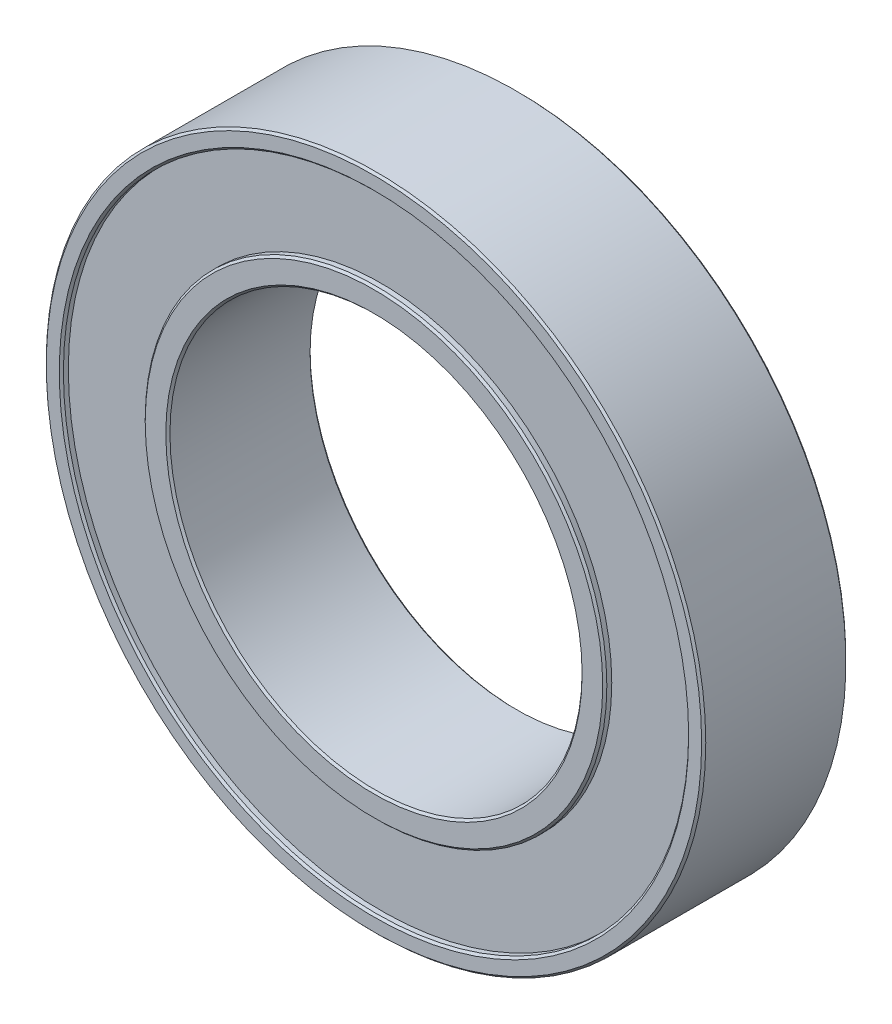
ISO-10303-21;
HEADER;
FILE_DESCRIPTION(('STEP AP214'),'2;1');
FILE_NAME('part.step','',(''),(''),'','','');
FILE_SCHEMA(('AUTOMOTIVE_DESIGN { 1 0 10303 214 1 1 1 1 }'));
ENDSEC;
DATA;
#1=APPLICATION_CONTEXT('core data for automotive mechanical design processes');
#2=APPLICATION_PROTOCOL_DEFINITION('international standard','automotive_design',2000,#1);
#3=PRODUCT_CONTEXT('',#1,'mechanical');
#4=PRODUCT('Part','Part','',(#3));
#5=PRODUCT_RELATED_PRODUCT_CATEGORY('part','',(#4));
#6=PRODUCT_DEFINITION_FORMATION('','',#4);
#7=PRODUCT_DEFINITION_CONTEXT('part definition',#1,'design');
#8=PRODUCT_DEFINITION('design','',#6,#7);
#9=PRODUCT_DEFINITION_SHAPE('','',#8);
#10=(LENGTH_UNIT() NAMED_UNIT(*) SI_UNIT(.MILLI.,.METRE.));
#11=(NAMED_UNIT(*) PLANE_ANGLE_UNIT() SI_UNIT($,.RADIAN.));
#12=(NAMED_UNIT(*) SI_UNIT($,.STERADIAN.) SOLID_ANGLE_UNIT());
#13=UNCERTAINTY_MEASURE_WITH_UNIT(LENGTH_MEASURE(1.E-05),#10,'distance_accuracy_value','');
#14=(GEOMETRIC_REPRESENTATION_CONTEXT(3) GLOBAL_UNCERTAINTY_ASSIGNED_CONTEXT((#13)) GLOBAL_UNIT_ASSIGNED_CONTEXT((#10,
#11,#12)) REPRESENTATION_CONTEXT('',''));
#15=CARTESIAN_POINT('',(0.,0.,0.));
#16=DIRECTION('',(0.,0.,1.));
#17=DIRECTION('',(1.,0.,0.));
#18=AXIS2_PLACEMENT_3D('',#15,#16,#17);
#19=CARTESIAN_POINT('',(0.,11.1995927193954,-3.5));
#20=DIRECTION('',(0.,0.,-1.));
#21=DIRECTION('',(-1.,0.,0.));
#22=AXIS2_PLACEMENT_3D('',#19,#20,#21);
#23=PLANE('',#22);
#24=CARTESIAN_POINT('',(0.,0.,-3.5));
#25=DIRECTION('',(0.,0.,-1.));
#26=DIRECTION('',(-1.,0.,0.));
#27=AXIS2_PLACEMENT_3D('',#24,#25,#26);
#28=CIRCLE('',#27,11.0995927193954);
#29=CARTESIAN_POINT('',(-11.0995927193954,0.,-3.5));
#30=VERTEX_POINT('',#29);
#31=EDGE_CURVE('E74',#30,#30,#28,.T.);
#32=ORIENTED_EDGE('',*,*,#31,.T.);
#33=EDGE_LOOP('',(#32));
#34=FACE_BOUND('',#33,.T.);
#35=CARTESIAN_POINT('',(0.,0.,-3.5));
#36=DIRECTION('',(0.,0.,-1.));
#37=DIRECTION('',(-1.,0.,0.));
#38=AXIS2_PLACEMENT_3D('',#35,#36,#37);
#39=CIRCLE('',#38,10.1);
#40=CARTESIAN_POINT('',(-10.1,0.,-3.5));
#41=VERTEX_POINT('',#40);
#42=EDGE_CURVE('E77',#41,#41,#39,.F.);
#43=ORIENTED_EDGE('',*,*,#42,.T.);
#44=EDGE_LOOP('',(#43));
#45=FACE_BOUND('',#44,.T.);
#46=ADVANCED_FACE('F33',(#34,#45),#23,.T.);
#47=CARTESIAN_POINT('',(0.,0.,-19.0782719959034));
#48=DIRECTION('',(0.,0.,-1.));
#49=DIRECTION('',(-1.,0.,0.));
#50=AXIS2_PLACEMENT_3D('',#47,#48,#49);
#51=CYLINDRICAL_SURFACE('',#50,11.1995927193954);
#52=CARTESIAN_POINT('',(0.,0.,-3.39999999999999));
#53=DIRECTION('',(0.,0.,-1.));
#54=DIRECTION('',(-1.,0.,0.));
#55=AXIS2_PLACEMENT_3D('',#52,#53,#54);
#56=CIRCLE('',#55,11.1995927193954);
#57=CARTESIAN_POINT('',(-11.1995927193954,0.,-3.39999999999999));
#58=VERTEX_POINT('',#57);
#59=EDGE_CURVE('E71',#58,#58,#56,.F.);
#60=ORIENTED_EDGE('',*,*,#59,.T.);
#61=EDGE_LOOP('',(#60));
#62=FACE_BOUND('',#61,.T.);
#63=CARTESIAN_POINT('',(0.,0.,-3.16032537077569));
#64=DIRECTION('',(0.,0.,-1.));
#65=DIRECTION('',(-1.,0.,0.));
#66=AXIS2_PLACEMENT_3D('',#63,#64,#65);
#67=CIRCLE('',#66,11.1995927193954);
#68=CARTESIAN_POINT('',(-11.1995927193954,0.,-3.16032537077569));
#69=VERTEX_POINT('',#68);
#70=EDGE_CURVE('E89',#69,#69,#67,.T.);
#71=ORIENTED_EDGE('',*,*,#70,.T.);
#72=EDGE_LOOP('',(#71));
#73=FACE_BOUND('',#72,.T.);
#74=ADVANCED_FACE('F120',(#62,#73),#51,.T.);
#75=CARTESIAN_POINT('',(0.,15.1693611984556,-3.16032537077569));
#76=DIRECTION('',(0.,0.,-1.));
#77=DIRECTION('',(-1.,0.,0.));
#78=AXIS2_PLACEMENT_3D('',#75,#76,#77);
#79=PLANE('',#78);
#80=CARTESIAN_POINT('',(0.,0.,-3.16032537077569));
#81=DIRECTION('',(0.,0.,-1.));
#82=DIRECTION('',(-1.,0.,0.));
#83=AXIS2_PLACEMENT_3D('',#80,#81,#82);
#84=CIRCLE('',#83,15.1693611984556);
#85=CARTESIAN_POINT('',(-15.1693611984556,0.,-3.16032537077569));
#86=VERTEX_POINT('',#85);
#87=EDGE_CURVE('E92',#86,#86,#84,.T.);
#88=ORIENTED_EDGE('',*,*,#87,.T.);
#89=EDGE_LOOP('',(#88));
#90=FACE_BOUND('',#89,.T.);
#91=ORIENTED_EDGE('',*,*,#70,.F.);
#92=EDGE_LOOP('',(#91));
#93=FACE_BOUND('',#92,.T.);
#94=ADVANCED_FACE('F126',(#90,#93),#79,.T.);
#95=CARTESIAN_POINT('',(0.,0.,-19.0782719959034));
#96=DIRECTION('',(0.,0.,-1.));
#97=DIRECTION('',(-1.,0.,0.));
#98=AXIS2_PLACEMENT_3D('',#95,#96,#97);
#99=CYLINDRICAL_SURFACE('',#98,15.1693611984556);
#100=CARTESIAN_POINT('',(0.,0.,-3.4));
#101=DIRECTION('',(0.,0.,-1.));
#102=DIRECTION('',(-1.,0.,0.));
#103=AXIS2_PLACEMENT_3D('',#100,#101,#102);
#104=CIRCLE('',#103,15.1693611984556);
#105=CARTESIAN_POINT('',(-15.1693611984556,0.,-3.4));
#106=VERTEX_POINT('',#105);
#107=EDGE_CURVE('E86',#106,#106,#104,.T.);
#108=ORIENTED_EDGE('',*,*,#107,.T.);
#109=EDGE_LOOP('',(#108));
#110=FACE_BOUND('',#109,.T.);
#111=ORIENTED_EDGE('',*,*,#87,.F.);
#112=EDGE_LOOP('',(#111));
#113=FACE_BOUND('',#112,.T.);
#114=ADVANCED_FACE('F181',(#110,#113),#99,.F.);
#115=CARTESIAN_POINT('',(0.,16.,-3.5));
#116=DIRECTION('',(0.,0.,-1.));
#117=DIRECTION('',(-1.,0.,0.));
#118=AXIS2_PLACEMENT_3D('',#115,#116,#117);
#119=PLANE('',#118);
#120=CARTESIAN_POINT('',(0.,0.,-3.5));
#121=DIRECTION('',(0.,0.,-1.));
#122=DIRECTION('',(-1.,0.,0.));
#123=AXIS2_PLACEMENT_3D('',#120,#121,#122);
#124=CIRCLE('',#123,15.2693611984556);
#125=CARTESIAN_POINT('',(-15.2693611984556,0.,-3.5));
#126=VERTEX_POINT('',#125);
#127=EDGE_CURVE('E80',#126,#126,#124,.F.);
#128=ORIENTED_EDGE('',*,*,#127,.T.);
#129=EDGE_LOOP('',(#128));
#130=FACE_BOUND('',#129,.T.);
#131=CARTESIAN_POINT('',(0.,0.,-3.5));
#132=DIRECTION('',(0.,0.,-1.));
#133=DIRECTION('',(-1.,0.,0.));
#134=AXIS2_PLACEMENT_3D('',#131,#132,#133);
#135=CIRCLE('',#134,15.9);
#136=CARTESIAN_POINT('',(-15.9,0.,-3.5));
#137=VERTEX_POINT('',#136);
#138=EDGE_CURVE('E83',#137,#137,#135,.T.);
#139=ORIENTED_EDGE('',*,*,#138,.T.);
#140=EDGE_LOOP('',(#139));
#141=FACE_BOUND('',#140,.T.);
#142=ADVANCED_FACE('F176',(#130,#141),#119,.T.);
#143=CARTESIAN_POINT('',(0.,0.,-19.0782719959034));
#144=DIRECTION('',(0.,0.,-1.));
#145=DIRECTION('',(-1.,0.,0.));
#146=AXIS2_PLACEMENT_3D('',#143,#144,#145);
#147=CYLINDRICAL_SURFACE('',#146,16.);
#148=CARTESIAN_POINT('',(0.,0.,3.4));
#149=DIRECTION('',(0.,0.,1.));
#150=DIRECTION('',(1.,0.,0.));
#151=AXIS2_PLACEMENT_3D('',#148,#149,#150);
#152=CIRCLE('',#151,16.);
#153=CARTESIAN_POINT('',(16.,0.,3.4));
#154=VERTEX_POINT('',#153);
#155=EDGE_CURVE('E10',#154,#154,#152,.F.);
#156=ORIENTED_EDGE('',*,*,#155,.T.);
#157=EDGE_LOOP('',(#156));
#158=FACE_BOUND('',#157,.T.);
#159=CARTESIAN_POINT('',(0.,0.,-3.39999999999998));
#160=DIRECTION('',(0.,0.,-1.));
#161=DIRECTION('',(-1.,0.,0.));
#162=AXIS2_PLACEMENT_3D('',#159,#160,#161);
#163=CIRCLE('',#162,16.);
#164=CARTESIAN_POINT('',(-16.,0.,-3.39999999999998));
#165=VERTEX_POINT('',#164);
#166=EDGE_CURVE('E40',#165,#165,#163,.F.);
#167=ORIENTED_EDGE('',*,*,#166,.T.);
#168=EDGE_LOOP('',(#167));
#169=FACE_BOUND('',#168,.T.);
#170=ADVANCED_FACE('F167',(#158,#169),#147,.T.);
#171=CARTESIAN_POINT('',(0.,16.,3.5));
#172=DIRECTION('',(0.,0.,1.));
#173=DIRECTION('',(1.,0.,0.));
#174=AXIS2_PLACEMENT_3D('',#171,#172,#173);
#175=PLANE('',#174);
#176=CARTESIAN_POINT('',(0.,0.,3.5));
#177=DIRECTION('',(0.,0.,1.));
#178=DIRECTION('',(1.,0.,0.));
#179=AXIS2_PLACEMENT_3D('',#176,#177,#178);
#180=CIRCLE('',#179,15.2693611984556);
#181=CARTESIAN_POINT('',(15.2693611984556,0.,3.5));
#182=VERTEX_POINT('',#181);
#183=EDGE_CURVE('E65',#182,#182,#180,.F.);
#184=ORIENTED_EDGE('',*,*,#183,.T.);
#185=EDGE_LOOP('',(#184));
#186=FACE_BOUND('',#185,.T.);
#187=CARTESIAN_POINT('',(0.,0.,3.5));
#188=DIRECTION('',(0.,0.,1.));
#189=DIRECTION('',(1.,0.,0.));
#190=AXIS2_PLACEMENT_3D('',#187,#188,#189);
#191=CIRCLE('',#190,15.9);
#192=CARTESIAN_POINT('',(15.9,0.,3.5));
#193=VERTEX_POINT('',#192);
#194=EDGE_CURVE('E68',#193,#193,#191,.T.);
#195=ORIENTED_EDGE('',*,*,#194,.T.);
#196=EDGE_LOOP('',(#195));
#197=FACE_BOUND('',#196,.T.);
#198=ADVANCED_FACE('F165',(#186,#197),#175,.T.);
#199=CARTESIAN_POINT('',(0.,0.,-19.0782719959034));
#200=DIRECTION('',(0.,0.,-1.));
#201=DIRECTION('',(-1.,0.,0.));
#202=AXIS2_PLACEMENT_3D('',#199,#200,#201);
#203=CYLINDRICAL_SURFACE('',#202,15.1693611984556);
#204=CARTESIAN_POINT('',(0.,0.,3.4));
#205=DIRECTION('',(0.,0.,1.));
#206=DIRECTION('',(1.,0.,0.));
#207=AXIS2_PLACEMENT_3D('',#204,#205,#206);
#208=CIRCLE('',#207,15.1693611984556);
#209=CARTESIAN_POINT('',(15.1693611984556,0.,3.4));
#210=VERTEX_POINT('',#209);
#211=EDGE_CURVE('E62',#210,#210,#208,.T.);
#212=ORIENTED_EDGE('',*,*,#211,.T.);
#213=EDGE_LOOP('',(#212));
#214=FACE_BOUND('',#213,.T.);
#215=CARTESIAN_POINT('',(0.,0.,3.1603253707757));
#216=DIRECTION('',(0.,0.,-1.));
#217=DIRECTION('',(-1.,0.,0.));
#218=AXIS2_PLACEMENT_3D('',#215,#216,#217);
#219=CIRCLE('',#218,15.1693611984556);
#220=CARTESIAN_POINT('',(-15.1693611984556,0.,3.1603253707757));
#221=VERTEX_POINT('',#220);
#222=EDGE_CURVE('E95',#221,#221,#219,.T.);
#223=ORIENTED_EDGE('',*,*,#222,.T.);
#224=EDGE_LOOP('',(#223));
#225=FACE_BOUND('',#224,.T.);
#226=ADVANCED_FACE('F117',(#214,#225),#203,.F.);
#227=CARTESIAN_POINT('',(0.,15.1693611984556,3.1603253707757));
#228=DIRECTION('',(0.,0.,1.));
#229=DIRECTION('',(1.,0.,0.));
#230=AXIS2_PLACEMENT_3D('',#227,#228,#229);
#231=PLANE('',#230);
#232=CARTESIAN_POINT('',(0.,0.,3.1603253707757));
#233=DIRECTION('',(0.,0.,-1.));
#234=DIRECTION('',(-1.,0.,0.));
#235=AXIS2_PLACEMENT_3D('',#232,#233,#234);
#236=CIRCLE('',#235,11.1995927193954);
#237=CARTESIAN_POINT('',(-11.1995927193954,0.,3.1603253707757));
#238=VERTEX_POINT('',#237);
#239=EDGE_CURVE('E98',#238,#238,#236,.T.);
#240=ORIENTED_EDGE('',*,*,#239,.T.);
#241=EDGE_LOOP('',(#240));
#242=FACE_BOUND('',#241,.T.);
#243=ORIENTED_EDGE('',*,*,#222,.F.);
#244=EDGE_LOOP('',(#243));
#245=FACE_BOUND('',#244,.T.);
#246=ADVANCED_FACE('F102',(#242,#245),#231,.T.);
#247=CARTESIAN_POINT('',(0.,0.,-19.0782719959034));
#248=DIRECTION('',(0.,0.,-1.));
#249=DIRECTION('',(-1.,0.,0.));
#250=AXIS2_PLACEMENT_3D('',#247,#248,#249);
#251=CYLINDRICAL_SURFACE('',#250,11.1995927193954);
#252=CARTESIAN_POINT('',(0.,0.,3.4));
#253=DIRECTION('',(0.,0.,1.));
#254=DIRECTION('',(1.,0.,0.));
#255=AXIS2_PLACEMENT_3D('',#252,#253,#254);
#256=CIRCLE('',#255,11.1995927193954);
#257=CARTESIAN_POINT('',(11.1995927193954,0.,3.4));
#258=VERTEX_POINT('',#257);
#259=EDGE_CURVE('E59',#258,#258,#256,.F.);
#260=ORIENTED_EDGE('',*,*,#259,.T.);
#261=EDGE_LOOP('',(#260));
#262=FACE_BOUND('',#261,.T.);
#263=ORIENTED_EDGE('',*,*,#239,.F.);
#264=EDGE_LOOP('',(#263));
#265=FACE_BOUND('',#264,.T.);
#266=ADVANCED_FACE('F105',(#262,#265),#251,.T.);
#267=CARTESIAN_POINT('',(0.,11.1995927193954,3.5));
#268=DIRECTION('',(0.,0.,1.));
#269=DIRECTION('',(1.,0.,0.));
#270=AXIS2_PLACEMENT_3D('',#267,#268,#269);
#271=PLANE('',#270);
#272=CARTESIAN_POINT('',(0.,0.,3.5));
#273=DIRECTION('',(0.,0.,1.));
#274=DIRECTION('',(1.,0.,0.));
#275=AXIS2_PLACEMENT_3D('',#272,#273,#274);
#276=CIRCLE('',#275,11.0995927193954);
#277=CARTESIAN_POINT('',(11.0995927193954,0.,3.5));
#278=VERTEX_POINT('',#277);
#279=EDGE_CURVE('E53',#278,#278,#276,.T.);
#280=ORIENTED_EDGE('',*,*,#279,.T.);
#281=EDGE_LOOP('',(#280));
#282=FACE_BOUND('',#281,.T.);
#283=CARTESIAN_POINT('',(0.,0.,3.5));
#284=DIRECTION('',(0.,0.,1.));
#285=DIRECTION('',(1.,0.,0.));
#286=AXIS2_PLACEMENT_3D('',#283,#284,#285);
#287=CIRCLE('',#286,10.1);
#288=CARTESIAN_POINT('',(10.1,0.,3.5));
#289=VERTEX_POINT('',#288);
#290=EDGE_CURVE('E56',#289,#289,#287,.F.);
#291=ORIENTED_EDGE('',*,*,#290,.T.);
#292=EDGE_LOOP('',(#291));
#293=FACE_BOUND('',#292,.T.);
#294=ADVANCED_FACE('F107',(#282,#293),#271,.T.);
#295=CARTESIAN_POINT('',(0.,0.,-19.0782719959034));
#296=DIRECTION('',(0.,0.,-1.));
#297=DIRECTION('',(-1.,0.,0.));
#298=AXIS2_PLACEMENT_3D('',#295,#296,#297);
#299=CYLINDRICAL_SURFACE('',#298,10.);
#300=CARTESIAN_POINT('',(0.,0.,-3.4));
#301=DIRECTION('',(0.,0.,-1.));
#302=DIRECTION('',(-1.,0.,0.));
#303=AXIS2_PLACEMENT_3D('',#300,#301,#302);
#304=CIRCLE('',#303,10.);
#305=CARTESIAN_POINT('',(-10.,0.,-3.4));
#306=VERTEX_POINT('',#305);
#307=EDGE_CURVE('E44',#306,#306,#304,.T.);
#308=ORIENTED_EDGE('',*,*,#307,.T.);
#309=EDGE_LOOP('',(#308));
#310=FACE_BOUND('',#309,.T.);
#311=CARTESIAN_POINT('',(0.,0.,3.4));
#312=DIRECTION('',(0.,0.,1.));
#313=DIRECTION('',(1.,0.,0.));
#314=AXIS2_PLACEMENT_3D('',#311,#312,#313);
#315=CIRCLE('',#314,10.);
#316=CARTESIAN_POINT('',(10.,0.,3.4));
#317=VERTEX_POINT('',#316);
#318=EDGE_CURVE('E48',#317,#317,#315,.T.);
#319=ORIENTED_EDGE('',*,*,#318,.T.);
#320=EDGE_LOOP('',(#319));
#321=FACE_BOUND('',#320,.T.);
#322=ADVANCED_FACE('F114',(#310,#321),#299,.F.);
#323=CARTESIAN_POINT('',(0.,0.,-3.4));
#324=DIRECTION('',(0.,0.,-1.));
#325=DIRECTION('',(-1.,0.,0.));
#326=AXIS2_PLACEMENT_3D('',#323,#324,#325);
#327=CONICAL_SURFACE('',#326,15.1693611984556,0.78539816339744);
#328=ORIENTED_EDGE('',*,*,#127,.F.);
#329=EDGE_LOOP('',(#328));
#330=FACE_BOUND('',#329,.T.);
#331=ORIENTED_EDGE('',*,*,#107,.F.);
#332=EDGE_LOOP('',(#331));
#333=FACE_BOUND('',#332,.T.);
#334=ADVANCED_FACE('F132',(#330,#333),#327,.F.);
#335=CARTESIAN_POINT('',(0.,0.,-3.5));
#336=DIRECTION('',(0.,0.,1.));
#337=DIRECTION('',(1.,0.,0.));
#338=AXIS2_PLACEMENT_3D('',#335,#336,#337);
#339=CONICAL_SURFACE('',#338,11.0995927193954,0.78539816339744);
#340=ORIENTED_EDGE('',*,*,#59,.F.);
#341=EDGE_LOOP('',(#340));
#342=FACE_BOUND('',#341,.T.);
#343=ORIENTED_EDGE('',*,*,#31,.F.);
#344=EDGE_LOOP('',(#343));
#345=FACE_BOUND('',#344,.T.);
#346=ADVANCED_FACE('F135',(#342,#345),#339,.T.);
#347=CARTESIAN_POINT('',(0.,0.,3.5));
#348=DIRECTION('',(0.,0.,1.));
#349=DIRECTION('',(1.,0.,0.));
#350=AXIS2_PLACEMENT_3D('',#347,#348,#349);
#351=CONICAL_SURFACE('',#350,15.2693611984556,0.785398163397457);
#352=ORIENTED_EDGE('',*,*,#211,.F.);
#353=EDGE_LOOP('',(#352));
#354=FACE_BOUND('',#353,.T.);
#355=ORIENTED_EDGE('',*,*,#183,.F.);
#356=EDGE_LOOP('',(#355));
#357=FACE_BOUND('',#356,.T.);
#358=ADVANCED_FACE('F139',(#354,#357),#351,.F.);
#359=CARTESIAN_POINT('',(0.,0.,3.4));
#360=DIRECTION('',(0.,0.,-1.));
#361=DIRECTION('',(-1.,0.,0.));
#362=AXIS2_PLACEMENT_3D('',#359,#360,#361);
#363=CONICAL_SURFACE('',#362,11.1995927193954,0.785398163397457);
#364=ORIENTED_EDGE('',*,*,#279,.F.);
#365=EDGE_LOOP('',(#364));
#366=FACE_BOUND('',#365,.T.);
#367=ORIENTED_EDGE('',*,*,#259,.F.);
#368=EDGE_LOOP('',(#367));
#369=FACE_BOUND('',#368,.T.);
#370=ADVANCED_FACE('F143',(#366,#369),#363,.T.);
#371=CARTESIAN_POINT('',(0.,0.,-3.4));
#372=DIRECTION('',(0.,0.,-1.));
#373=DIRECTION('',(-1.,0.,0.));
#374=AXIS2_PLACEMENT_3D('',#371,#372,#373);
#375=CONICAL_SURFACE('',#374,10.,0.785398163397457);
#376=ORIENTED_EDGE('',*,*,#42,.F.);
#377=EDGE_LOOP('',(#376));
#378=FACE_BOUND('',#377,.T.);
#379=ORIENTED_EDGE('',*,*,#307,.F.);
#380=EDGE_LOOP('',(#379));
#381=FACE_BOUND('',#380,.T.);
#382=ADVANCED_FACE('F147',(#378,#381),#375,.F.);
#383=CARTESIAN_POINT('',(0.,0.,3.5));
#384=DIRECTION('',(0.,0.,1.));
#385=DIRECTION('',(1.,0.,0.));
#386=AXIS2_PLACEMENT_3D('',#383,#384,#385);
#387=CONICAL_SURFACE('',#386,10.1,0.785398163397457);
#388=ORIENTED_EDGE('',*,*,#318,.F.);
#389=EDGE_LOOP('',(#388));
#390=FACE_BOUND('',#389,.T.);
#391=ORIENTED_EDGE('',*,*,#290,.F.);
#392=EDGE_LOOP('',(#391));
#393=FACE_BOUND('',#392,.T.);
#394=ADVANCED_FACE('F151',(#390,#393),#387,.F.);
#395=CARTESIAN_POINT('',(0.,0.,3.4));
#396=DIRECTION('',(0.,0.,-1.));
#397=DIRECTION('',(-1.,0.,0.));
#398=AXIS2_PLACEMENT_3D('',#395,#396,#397);
#399=CONICAL_SURFACE('',#398,16.,0.785398163397448);
#400=ORIENTED_EDGE('',*,*,#194,.F.);
#401=EDGE_LOOP('',(#400));
#402=FACE_BOUND('',#401,.T.);
#403=ORIENTED_EDGE('',*,*,#155,.F.);
#404=EDGE_LOOP('',(#403));
#405=FACE_BOUND('',#404,.T.);
#406=ADVANCED_FACE('F154',(#402,#405),#399,.T.);
#407=CARTESIAN_POINT('',(0.,0.,-3.5));
#408=DIRECTION('',(0.,0.,1.));
#409=DIRECTION('',(1.,0.,0.));
#410=AXIS2_PLACEMENT_3D('',#407,#408,#409);
#411=CONICAL_SURFACE('',#410,15.9,0.785398163397414);
#412=ORIENTED_EDGE('',*,*,#166,.F.);
#413=EDGE_LOOP('',(#412));
#414=FACE_BOUND('',#413,.T.);
#415=ORIENTED_EDGE('',*,*,#138,.F.);
#416=EDGE_LOOP('',(#415));
#417=FACE_BOUND('',#416,.T.);
#418=ADVANCED_FACE('F35',(#414,#417),#411,.T.);
#419=CLOSED_SHELL('',(#46,#74,#94,#114,#142,#170,#198,#226,#246,#266,#294,#322,#334,#346,#358,
#370,#382,#394,#406,#418));
#420=MANIFOLD_SOLID_BREP('B2',#419);
#421=ADVANCED_BREP_SHAPE_REPRESENTATION('',(#18,#420),#14);
#422=SHAPE_DEFINITION_REPRESENTATION(#9,#421);
ENDSEC;
END-ISO-10303-21;
